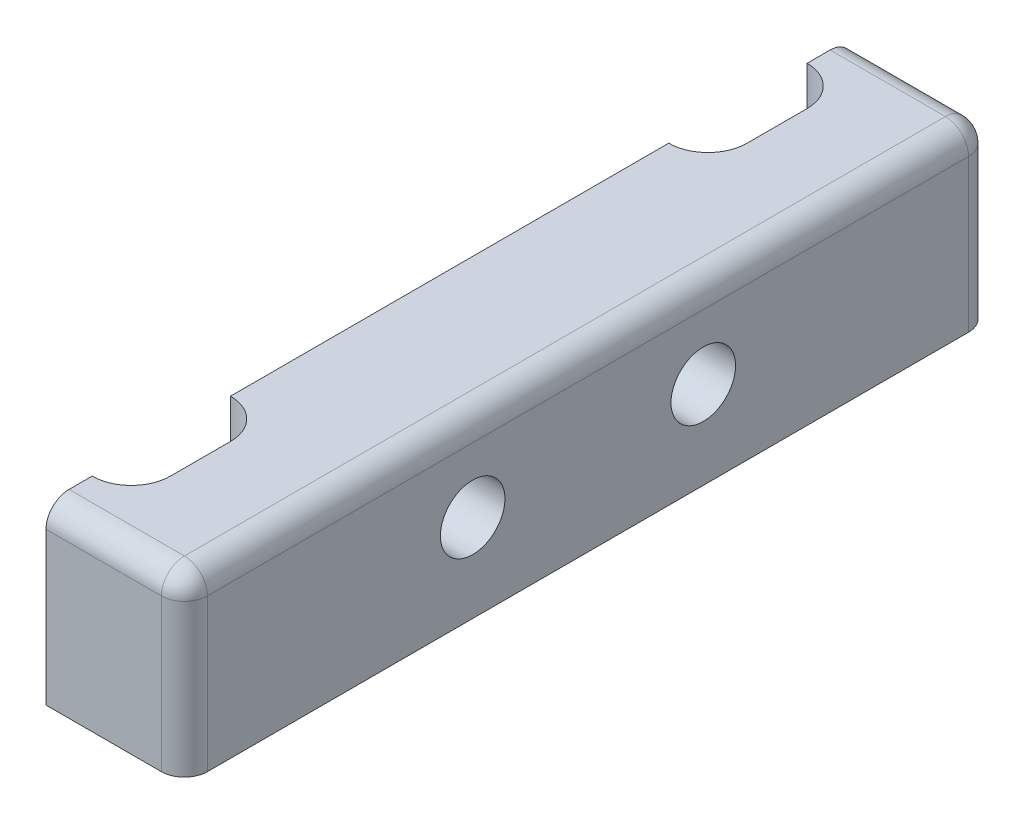
ISO-10303-21;
HEADER;
FILE_DESCRIPTION(('STEP AP214'),'2;1');
FILE_NAME('part.step','',(''),(''),'','','');
FILE_SCHEMA(('AUTOMOTIVE_DESIGN { 1 0 10303 214 1 1 1 1 }'));
ENDSEC;
DATA;
#1=APPLICATION_CONTEXT('core data for automotive mechanical design processes');
#2=APPLICATION_PROTOCOL_DEFINITION('international standard','automotive_design',2000,#1);
#3=PRODUCT_CONTEXT('',#1,'mechanical');
#4=PRODUCT('Part','Part','',(#3));
#5=PRODUCT_RELATED_PRODUCT_CATEGORY('part','',(#4));
#6=PRODUCT_DEFINITION_FORMATION('','',#4);
#7=PRODUCT_DEFINITION_CONTEXT('part definition',#1,'design');
#8=PRODUCT_DEFINITION('design','',#6,#7);
#9=PRODUCT_DEFINITION_SHAPE('','',#8);
#10=(LENGTH_UNIT() NAMED_UNIT(*) SI_UNIT(.MILLI.,.METRE.));
#11=(NAMED_UNIT(*) PLANE_ANGLE_UNIT() SI_UNIT($,.RADIAN.));
#12=(NAMED_UNIT(*) SI_UNIT($,.STERADIAN.) SOLID_ANGLE_UNIT());
#13=UNCERTAINTY_MEASURE_WITH_UNIT(LENGTH_MEASURE(1.E-05),#10,'distance_accuracy_value','');
#14=(GEOMETRIC_REPRESENTATION_CONTEXT(3) GLOBAL_UNCERTAINTY_ASSIGNED_CONTEXT((#13)) GLOBAL_UNIT_ASSIGNED_CONTEXT((#10,
#11,#12)) REPRESENTATION_CONTEXT('',''));
#15=CARTESIAN_POINT('',(0.,0.,0.));
#16=DIRECTION('',(0.,0.,1.));
#17=DIRECTION('',(1.,0.,0.));
#18=AXIS2_PLACEMENT_3D('',#15,#16,#17);
#19=CARTESIAN_POINT('',(-6.,7.6,-17.5));
#20=DIRECTION('',(0.,0.,1.));
#21=DIRECTION('',(1.,0.,0.));
#22=AXIS2_PLACEMENT_3D('',#19,#20,#21);
#23=PLANE('',#22);
#24=DIRECTION('',(-1.,0.,0.));
#25=VECTOR('',#24,1.);
#26=CARTESIAN_POINT('',(-6.,6.6,-17.5));
#27=LINE('',#26,#25);
#28=CARTESIAN_POINT('',(-6.,6.6,-17.5));
#29=VERTEX_POINT('',#28);
#30=CARTESIAN_POINT('',(-1.00000000000001,6.6,-17.5));
#31=VERTEX_POINT('',#30);
#32=EDGE_CURVE('E276',#29,#31,#27,.F.);
#33=ORIENTED_EDGE('',*,*,#32,.T.);
#34=DIRECTION('',(0.,-1.,0.));
#35=VECTOR('',#34,1.);
#36=CARTESIAN_POINT('',(-1.00000000000001,7.6,-17.5));
#37=LINE('',#36,#35);
#38=CARTESIAN_POINT('',(-1.00000000000001,0.,-17.5));
#39=VERTEX_POINT('',#38);
#40=EDGE_CURVE('E279',#31,#39,#37,.T.);
#41=ORIENTED_EDGE('',*,*,#40,.T.);
#42=DIRECTION('',(-1.,0.,0.));
#43=VECTOR('',#42,1.);
#44=CARTESIAN_POINT('',(-6.,0.,-17.5));
#45=LINE('',#44,#43);
#46=CARTESIAN_POINT('',(-6.,0.,-17.5));
#47=VERTEX_POINT('',#46);
#48=EDGE_CURVE('E208',#39,#47,#45,.T.);
#49=ORIENTED_EDGE('',*,*,#48,.T.);
#50=DIRECTION('',(0.,-1.,0.));
#51=VECTOR('',#50,1.);
#52=CARTESIAN_POINT('',(-6.,7.6,-17.5));
#53=LINE('',#52,#51);
#54=EDGE_CURVE('E175',#29,#47,#53,.T.);
#55=ORIENTED_EDGE('',*,*,#54,.F.);
#56=EDGE_LOOP('',(#33,#41,#49,#55));
#57=FACE_BOUND('',#56,.T.);
#58=ADVANCED_FACE('F42',(#57),#23,.F.);
#59=CARTESIAN_POINT('',(-6.,7.6,-17.5));
#60=DIRECTION('',(1.,0.,0.));
#61=DIRECTION('',(0.,0.,-1.));
#62=AXIS2_PLACEMENT_3D('',#59,#60,#61);
#63=PLANE('',#62);
#64=DIRECTION('',(0.,0.,1.));
#65=VECTOR('',#64,1.);
#66=CARTESIAN_POINT('',(-6.,7.6,-17.5));
#67=LINE('',#66,#65);
#68=CARTESIAN_POINT('',(-6.,7.6,-16.5));
#69=VERTEX_POINT('',#68);
#70=CARTESIAN_POINT('',(-6.,7.6,-15.5));
#71=VERTEX_POINT('',#70);
#72=EDGE_CURVE('E154',#69,#71,#67,.T.);
#73=ORIENTED_EDGE('',*,*,#72,.F.);
#74=CARTESIAN_POINT('',(-6.,6.6,-16.5));
#75=DIRECTION('',(1.,0.,0.));
#76=DIRECTION('',(0.,0.,-1.));
#77=AXIS2_PLACEMENT_3D('',#74,#75,#76);
#78=CIRCLE('',#77,1.);
#79=EDGE_CURVE('E306',#69,#29,#78,.F.);
#80=ORIENTED_EDGE('',*,*,#79,.T.);
#81=ORIENTED_EDGE('',*,*,#54,.T.);
#82=DIRECTION('',(0.,0.,1.));
#83=VECTOR('',#82,1.);
#84=CARTESIAN_POINT('',(-6.,0.,-17.5));
#85=LINE('',#84,#83);
#86=CARTESIAN_POINT('',(-6.,0.,-15.5));
#87=VERTEX_POINT('',#86);
#88=EDGE_CURVE('E171',#47,#87,#85,.T.);
#89=ORIENTED_EDGE('',*,*,#88,.T.);
#90=DIRECTION('',(0.,-1.,0.));
#91=VECTOR('',#90,1.);
#92=CARTESIAN_POINT('',(-6.,7.6,-15.5));
#93=LINE('',#92,#91);
#94=EDGE_CURVE('E168',#71,#87,#93,.T.);
#95=ORIENTED_EDGE('',*,*,#94,.F.);
#96=EDGE_LOOP('',(#73,#80,#81,#89,#95));
#97=FACE_BOUND('',#96,.T.);
#98=ADVANCED_FACE('F169',(#97),#63,.F.);
#99=CARTESIAN_POINT('',(-6.,7.6,-13.8));
#100=DIRECTION('',(0.,-1.,0.));
#101=DIRECTION('',(0.,0.,-1.));
#102=AXIS2_PLACEMENT_3D('',#99,#100,#101);
#103=CYLINDRICAL_SURFACE('',#102,1.7);
#104=CARTESIAN_POINT('',(-6.,0.,-13.8));
#105=DIRECTION('',(0.,-1.,0.));
#106=DIRECTION('',(0.,0.,1.));
#107=AXIS2_PLACEMENT_3D('',#104,#105,#106);
#108=CIRCLE('',#107,1.7);
#109=CARTESIAN_POINT('',(-4.3,0.,-13.8));
#110=VERTEX_POINT('',#109);
#111=EDGE_CURVE('E215',#87,#110,#108,.T.);
#112=ORIENTED_EDGE('',*,*,#111,.T.);
#113=DIRECTION('',(0.,-1.,0.));
#114=VECTOR('',#113,1.);
#115=CARTESIAN_POINT('',(-4.3,7.6,-13.8));
#116=LINE('',#115,#114);
#117=CARTESIAN_POINT('',(-4.3,7.6,-13.8));
#118=VERTEX_POINT('',#117);
#119=EDGE_CURVE('E176',#118,#110,#116,.T.);
#120=ORIENTED_EDGE('',*,*,#119,.F.);
#121=CARTESIAN_POINT('',(-6.,7.6,-13.8));
#122=DIRECTION('',(0.,-1.,0.));
#123=DIRECTION('',(0.,0.,1.));
#124=AXIS2_PLACEMENT_3D('',#121,#122,#123);
#125=CIRCLE('',#124,1.7);
#126=EDGE_CURVE('E158',#71,#118,#125,.T.);
#127=ORIENTED_EDGE('',*,*,#126,.F.);
#128=ORIENTED_EDGE('',*,*,#94,.T.);
#129=EDGE_LOOP('',(#112,#120,#127,#128));
#130=FACE_BOUND('',#129,.T.);
#131=ADVANCED_FACE('F178',(#130),#103,.F.);
#132=CARTESIAN_POINT('',(-4.29999999999999,7.6,-11.2));
#133=DIRECTION('',(1.,0.,0.));
#134=DIRECTION('',(0.,0.,-1.));
#135=AXIS2_PLACEMENT_3D('',#132,#133,#134);
#136=PLANE('',#135);
#137=DIRECTION('',(0.,0.,1.));
#138=VECTOR('',#137,1.);
#139=CARTESIAN_POINT('',(-4.29999999999999,0.,-11.2));
#140=LINE('',#139,#138);
#141=CARTESIAN_POINT('',(-4.29999999999999,0.,-11.2));
#142=VERTEX_POINT('',#141);
#143=EDGE_CURVE('E218',#110,#142,#140,.T.);
#144=ORIENTED_EDGE('',*,*,#143,.T.);
#145=DIRECTION('',(0.,-1.,0.));
#146=VECTOR('',#145,1.);
#147=CARTESIAN_POINT('',(-4.29999999999999,7.6,-11.2));
#148=LINE('',#147,#146);
#149=CARTESIAN_POINT('',(-4.29999999999999,7.6,-11.2));
#150=VERTEX_POINT('',#149);
#151=EDGE_CURVE('E268',#150,#142,#148,.T.);
#152=ORIENTED_EDGE('',*,*,#151,.F.);
#153=DIRECTION('',(0.,0.,1.));
#154=VECTOR('',#153,1.);
#155=CARTESIAN_POINT('',(-4.29999999999999,7.6,-11.2));
#156=LINE('',#155,#154);
#157=EDGE_CURVE('E182',#118,#150,#156,.T.);
#158=ORIENTED_EDGE('',*,*,#157,.F.);
#159=ORIENTED_EDGE('',*,*,#119,.T.);
#160=EDGE_LOOP('',(#144,#152,#158,#159));
#161=FACE_BOUND('',#160,.T.);
#162=ADVANCED_FACE('F402',(#161),#136,.F.);
#163=CARTESIAN_POINT('',(-5.99999999999999,7.6,-11.2));
#164=DIRECTION('',(0.,-1.,0.));
#165=DIRECTION('',(0.,0.,-1.));
#166=AXIS2_PLACEMENT_3D('',#163,#164,#165);
#167=CYLINDRICAL_SURFACE('',#166,1.7);
#168=CARTESIAN_POINT('',(-5.99999999999999,0.,-11.2));
#169=DIRECTION('',(0.,-1.,0.));
#170=DIRECTION('',(0.,0.,-1.));
#171=AXIS2_PLACEMENT_3D('',#168,#169,#170);
#172=CIRCLE('',#171,1.7);
#173=CARTESIAN_POINT('',(-6.,0.,-9.49999999999999));
#174=VERTEX_POINT('',#173);
#175=EDGE_CURVE('E221',#142,#174,#172,.T.);
#176=ORIENTED_EDGE('',*,*,#175,.T.);
#177=DIRECTION('',(0.,-1.,0.));
#178=VECTOR('',#177,1.);
#179=CARTESIAN_POINT('',(-6.,7.6,-9.49999999999999));
#180=LINE('',#179,#178);
#181=CARTESIAN_POINT('',(-6.,7.6,-9.49999999999999));
#182=VERTEX_POINT('',#181);
#183=EDGE_CURVE('E264',#182,#174,#180,.T.);
#184=ORIENTED_EDGE('',*,*,#183,.F.);
#185=CARTESIAN_POINT('',(-5.99999999999999,7.6,-11.2));
#186=DIRECTION('',(0.,-1.,0.));
#187=DIRECTION('',(0.,0.,-1.));
#188=AXIS2_PLACEMENT_3D('',#185,#186,#187);
#189=CIRCLE('',#188,1.7);
#190=EDGE_CURVE('E185',#150,#182,#189,.T.);
#191=ORIENTED_EDGE('',*,*,#190,.F.);
#192=ORIENTED_EDGE('',*,*,#151,.T.);
#193=EDGE_LOOP('',(#176,#184,#191,#192));
#194=FACE_BOUND('',#193,.T.);
#195=ADVANCED_FACE('F368',(#194),#167,.F.);
#196=CARTESIAN_POINT('',(-6.,7.6,-9.49999999999999));
#197=DIRECTION('',(1.,0.,0.));
#198=DIRECTION('',(0.,0.,-1.));
#199=AXIS2_PLACEMENT_3D('',#196,#197,#198);
#200=PLANE('',#199);
#201=CARTESIAN_POINT('',(-6.,3.8,-4.99999999999999));
#202=DIRECTION('',(-1.,0.,0.));
#203=DIRECTION('',(0.,0.,1.));
#204=AXIS2_PLACEMENT_3D('',#201,#202,#203);
#205=CIRCLE('',#204,1.4);
#206=CARTESIAN_POINT('',(-6.,3.8,-3.6));
#207=VERTEX_POINT('',#206);
#208=EDGE_CURVE('E345',#207,#207,#205,.T.);
#209=ORIENTED_EDGE('',*,*,#208,.F.);
#210=EDGE_LOOP('',(#209));
#211=FACE_BOUND('',#210,.T.);
#212=CARTESIAN_POINT('',(-6.,3.79999999999999,5.));
#213=DIRECTION('',(-1.,0.,0.));
#214=DIRECTION('',(0.,0.,-1.));
#215=AXIS2_PLACEMENT_3D('',#212,#213,#214);
#216=CIRCLE('',#215,1.4);
#217=CARTESIAN_POINT('',(-6.,3.79999999999999,3.6));
#218=VERTEX_POINT('',#217);
#219=EDGE_CURVE('E340',#218,#218,#216,.T.);
#220=ORIENTED_EDGE('',*,*,#219,.F.);
#221=EDGE_LOOP('',(#220));
#222=FACE_BOUND('',#221,.T.);
#223=DIRECTION('',(0.,0.,1.));
#224=VECTOR('',#223,1.);
#225=CARTESIAN_POINT('',(-6.,0.,-9.49999999999999));
#226=LINE('',#225,#224);
#227=CARTESIAN_POINT('',(-6.,0.,9.50000000000001));
#228=VERTEX_POINT('',#227);
#229=EDGE_CURVE('E224',#174,#228,#226,.T.);
#230=ORIENTED_EDGE('',*,*,#229,.T.);
#231=DIRECTION('',(0.,-1.,0.));
#232=VECTOR('',#231,1.);
#233=CARTESIAN_POINT('',(-6.,7.6,9.50000000000001));
#234=LINE('',#233,#232);
#235=CARTESIAN_POINT('',(-6.,7.6,9.50000000000001));
#236=VERTEX_POINT('',#235);
#237=EDGE_CURVE('E260',#236,#228,#234,.T.);
#238=ORIENTED_EDGE('',*,*,#237,.F.);
#239=DIRECTION('',(0.,0.,1.));
#240=VECTOR('',#239,1.);
#241=CARTESIAN_POINT('',(-6.,7.6,-9.49999999999999));
#242=LINE('',#241,#240);
#243=EDGE_CURVE('E191',#182,#236,#242,.T.);
#244=ORIENTED_EDGE('',*,*,#243,.F.);
#245=ORIENTED_EDGE('',*,*,#183,.T.);
#246=EDGE_LOOP('',(#230,#238,#244,#245));
#247=FACE_BOUND('',#246,.T.);
#248=ADVANCED_FACE('F364',(#211,#222,#247),#200,.F.);
#249=CARTESIAN_POINT('',(-6.,7.6,11.2));
#250=DIRECTION('',(0.,-1.,0.));
#251=DIRECTION('',(0.,0.,-1.));
#252=AXIS2_PLACEMENT_3D('',#249,#250,#251);
#253=CYLINDRICAL_SURFACE('',#252,1.7);
#254=CARTESIAN_POINT('',(-6.,0.,11.2));
#255=DIRECTION('',(0.,-1.,0.));
#256=DIRECTION('',(0.,0.,1.));
#257=AXIS2_PLACEMENT_3D('',#254,#255,#256);
#258=CIRCLE('',#257,1.7);
#259=CARTESIAN_POINT('',(-4.3,0.,11.2));
#260=VERTEX_POINT('',#259);
#261=EDGE_CURVE('E227',#228,#260,#258,.T.);
#262=ORIENTED_EDGE('',*,*,#261,.T.);
#263=DIRECTION('',(0.,-1.,0.));
#264=VECTOR('',#263,1.);
#265=CARTESIAN_POINT('',(-4.3,7.6,11.2));
#266=LINE('',#265,#264);
#267=CARTESIAN_POINT('',(-4.3,7.6,11.2));
#268=VERTEX_POINT('',#267);
#269=EDGE_CURVE('E256',#268,#260,#266,.T.);
#270=ORIENTED_EDGE('',*,*,#269,.F.);
#271=CARTESIAN_POINT('',(-6.,7.6,11.2));
#272=DIRECTION('',(0.,-1.,0.));
#273=DIRECTION('',(0.,0.,1.));
#274=AXIS2_PLACEMENT_3D('',#271,#272,#273);
#275=CIRCLE('',#274,1.7);
#276=EDGE_CURVE('E194',#236,#268,#275,.T.);
#277=ORIENTED_EDGE('',*,*,#276,.F.);
#278=ORIENTED_EDGE('',*,*,#237,.T.);
#279=EDGE_LOOP('',(#262,#270,#277,#278));
#280=FACE_BOUND('',#279,.T.);
#281=ADVANCED_FACE('F367',(#280),#253,.F.);
#282=CARTESIAN_POINT('',(-4.29999999999999,7.6,13.8));
#283=DIRECTION('',(1.,0.,0.));
#284=DIRECTION('',(0.,0.,-1.));
#285=AXIS2_PLACEMENT_3D('',#282,#283,#284);
#286=PLANE('',#285);
#287=DIRECTION('',(0.,0.,1.));
#288=VECTOR('',#287,1.);
#289=CARTESIAN_POINT('',(-4.29999999999999,0.,13.8));
#290=LINE('',#289,#288);
#291=CARTESIAN_POINT('',(-4.29999999999999,0.,13.8));
#292=VERTEX_POINT('',#291);
#293=EDGE_CURVE('E230',#260,#292,#290,.T.);
#294=ORIENTED_EDGE('',*,*,#293,.T.);
#295=DIRECTION('',(0.,-1.,0.));
#296=VECTOR('',#295,1.);
#297=CARTESIAN_POINT('',(-4.29999999999999,7.6,13.8));
#298=LINE('',#297,#296);
#299=CARTESIAN_POINT('',(-4.29999999999999,7.6,13.8));
#300=VERTEX_POINT('',#299);
#301=EDGE_CURVE('E252',#300,#292,#298,.T.);
#302=ORIENTED_EDGE('',*,*,#301,.F.);
#303=DIRECTION('',(0.,0.,1.));
#304=VECTOR('',#303,1.);
#305=CARTESIAN_POINT('',(-4.29999999999999,7.6,13.8));
#306=LINE('',#305,#304);
#307=EDGE_CURVE('E197',#268,#300,#306,.T.);
#308=ORIENTED_EDGE('',*,*,#307,.F.);
#309=ORIENTED_EDGE('',*,*,#269,.T.);
#310=EDGE_LOOP('',(#294,#302,#308,#309));
#311=FACE_BOUND('',#310,.T.);
#312=ADVANCED_FACE('F389',(#311),#286,.F.);
#313=CARTESIAN_POINT('',(-6.,7.6,13.8));
#314=DIRECTION('',(0.,-1.,0.));
#315=DIRECTION('',(0.,0.,-1.));
#316=AXIS2_PLACEMENT_3D('',#313,#314,#315);
#317=CYLINDRICAL_SURFACE('',#316,1.7);
#318=CARTESIAN_POINT('',(-6.,0.,13.8));
#319=DIRECTION('',(0.,-1.,0.));
#320=DIRECTION('',(0.,0.,-1.));
#321=AXIS2_PLACEMENT_3D('',#318,#319,#320);
#322=CIRCLE('',#321,1.7);
#323=CARTESIAN_POINT('',(-6.,0.,15.5));
#324=VERTEX_POINT('',#323);
#325=EDGE_CURVE('E233',#292,#324,#322,.T.);
#326=ORIENTED_EDGE('',*,*,#325,.T.);
#327=DIRECTION('',(0.,-1.,0.));
#328=VECTOR('',#327,1.);
#329=CARTESIAN_POINT('',(-6.,7.6,15.5));
#330=LINE('',#329,#328);
#331=CARTESIAN_POINT('',(-6.,7.6,15.5));
#332=VERTEX_POINT('',#331);
#333=EDGE_CURVE('E248',#332,#324,#330,.T.);
#334=ORIENTED_EDGE('',*,*,#333,.F.);
#335=CARTESIAN_POINT('',(-6.,7.6,13.8));
#336=DIRECTION('',(0.,-1.,0.));
#337=DIRECTION('',(0.,0.,-1.));
#338=AXIS2_PLACEMENT_3D('',#335,#336,#337);
#339=CIRCLE('',#338,1.7);
#340=EDGE_CURVE('E200',#300,#332,#339,.T.);
#341=ORIENTED_EDGE('',*,*,#340,.F.);
#342=ORIENTED_EDGE('',*,*,#301,.T.);
#343=EDGE_LOOP('',(#326,#334,#341,#342));
#344=FACE_BOUND('',#343,.T.);
#345=ADVANCED_FACE('F393',(#344),#317,.F.);
#346=CARTESIAN_POINT('',(-6.,7.6,17.5));
#347=DIRECTION('',(1.,0.,0.));
#348=DIRECTION('',(0.,0.,-1.));
#349=AXIS2_PLACEMENT_3D('',#346,#347,#348);
#350=PLANE('',#349);
#351=DIRECTION('',(0.,-1.,0.));
#352=VECTOR('',#351,1.);
#353=CARTESIAN_POINT('',(-6.,7.6,17.5));
#354=LINE('',#353,#352);
#355=CARTESIAN_POINT('',(-6.,6.6,17.5));
#356=VERTEX_POINT('',#355);
#357=CARTESIAN_POINT('',(-6.,0.,17.5));
#358=VERTEX_POINT('',#357);
#359=EDGE_CURVE('E207',#356,#358,#354,.T.);
#360=ORIENTED_EDGE('',*,*,#359,.F.);
#361=CARTESIAN_POINT('',(-6.,6.6,16.5));
#362=DIRECTION('',(1.,0.,0.));
#363=DIRECTION('',(0.,0.,-1.));
#364=AXIS2_PLACEMENT_3D('',#361,#362,#363);
#365=CIRCLE('',#364,1.);
#366=CARTESIAN_POINT('',(-6.,7.6,16.5));
#367=VERTEX_POINT('',#366);
#368=EDGE_CURVE('E11',#356,#367,#365,.F.);
#369=ORIENTED_EDGE('',*,*,#368,.T.);
#370=DIRECTION('',(0.,0.,1.));
#371=VECTOR('',#370,1.);
#372=CARTESIAN_POINT('',(-6.,7.6,17.5));
#373=LINE('',#372,#371);
#374=EDGE_CURVE('E203',#332,#367,#373,.T.);
#375=ORIENTED_EDGE('',*,*,#374,.F.);
#376=ORIENTED_EDGE('',*,*,#333,.T.);
#377=DIRECTION('',(0.,0.,1.));
#378=VECTOR('',#377,1.);
#379=CARTESIAN_POINT('',(-6.,0.,17.5));
#380=LINE('',#379,#378);
#381=EDGE_CURVE('E236',#324,#358,#380,.T.);
#382=ORIENTED_EDGE('',*,*,#381,.T.);
#383=EDGE_LOOP('',(#360,#369,#375,#376,#382));
#384=FACE_BOUND('',#383,.T.);
#385=ADVANCED_FACE('F447',(#384),#350,.F.);
#386=CARTESIAN_POINT('',(-6.,7.6,17.5));
#387=DIRECTION('',(0.,0.,-1.));
#388=DIRECTION('',(-1.,0.,0.));
#389=AXIS2_PLACEMENT_3D('',#386,#387,#388);
#390=PLANE('',#389);
#391=DIRECTION('',(1.,0.,0.));
#392=VECTOR('',#391,1.);
#393=CARTESIAN_POINT('',(-6.,0.,17.5));
#394=LINE('',#393,#392);
#395=CARTESIAN_POINT('',(-0.999999999999995,0.,17.5));
#396=VERTEX_POINT('',#395);
#397=EDGE_CURVE('E240',#358,#396,#394,.T.);
#398=ORIENTED_EDGE('',*,*,#397,.T.);
#399=DIRECTION('',(0.,-1.,0.));
#400=VECTOR('',#399,1.);
#401=CARTESIAN_POINT('',(-0.999999999999995,7.6,17.5));
#402=LINE('',#401,#400);
#403=CARTESIAN_POINT('',(-0.999999999999995,6.6,17.5));
#404=VERTEX_POINT('',#403);
#405=EDGE_CURVE('E52',#396,#404,#402,.F.);
#406=ORIENTED_EDGE('',*,*,#405,.T.);
#407=DIRECTION('',(1.,0.,0.));
#408=VECTOR('',#407,1.);
#409=CARTESIAN_POINT('',(-6.,6.6,17.5));
#410=LINE('',#409,#408);
#411=EDGE_CURVE('E63',#404,#356,#410,.F.);
#412=ORIENTED_EDGE('',*,*,#411,.T.);
#413=ORIENTED_EDGE('',*,*,#359,.T.);
#414=EDGE_LOOP('',(#398,#406,#412,#413));
#415=FACE_BOUND('',#414,.T.);
#416=ADVANCED_FACE('F449',(#415),#390,.F.);
#417=CARTESIAN_POINT('',(0.,7.6,-17.5));
#418=DIRECTION('',(-1.,0.,0.));
#419=DIRECTION('',(0.,0.,1.));
#420=AXIS2_PLACEMENT_3D('',#417,#418,#419);
#421=PLANE('',#420);
#422=CARTESIAN_POINT('',(0.,3.8,-5.));
#423=DIRECTION('',(-1.,0.,0.));
#424=DIRECTION('',(0.,0.,1.));
#425=AXIS2_PLACEMENT_3D('',#422,#423,#424);
#426=CIRCLE('',#425,1.4);
#427=CARTESIAN_POINT('',(0.,3.8,-3.6));
#428=VERTEX_POINT('',#427);
#429=EDGE_CURVE('E212',#428,#428,#426,.T.);
#430=ORIENTED_EDGE('',*,*,#429,.T.);
#431=EDGE_LOOP('',(#430));
#432=FACE_BOUND('',#431,.T.);
#433=CARTESIAN_POINT('',(0.,3.79999999999999,5.));
#434=DIRECTION('',(-1.,0.,0.));
#435=DIRECTION('',(0.,0.,-1.));
#436=AXIS2_PLACEMENT_3D('',#433,#434,#435);
#437=CIRCLE('',#436,1.4);
#438=CARTESIAN_POINT('',(0.,3.79999999999999,3.6));
#439=VERTEX_POINT('',#438);
#440=EDGE_CURVE('E336',#439,#439,#437,.T.);
#441=ORIENTED_EDGE('',*,*,#440,.T.);
#442=EDGE_LOOP('',(#441));
#443=FACE_BOUND('',#442,.T.);
#444=DIRECTION('',(0.,0.,-1.));
#445=VECTOR('',#444,1.);
#446=CARTESIAN_POINT('',(0.,0.,-17.5));
#447=LINE('',#446,#445);
#448=CARTESIAN_POINT('',(0.,0.,16.5));
#449=VERTEX_POINT('',#448);
#450=CARTESIAN_POINT('',(0.,0.,-16.5));
#451=VERTEX_POINT('',#450);
#452=EDGE_CURVE('E165',#449,#451,#447,.T.);
#453=ORIENTED_EDGE('',*,*,#452,.T.);
#454=DIRECTION('',(0.,-1.,0.));
#455=VECTOR('',#454,1.);
#456=CARTESIAN_POINT('',(0.,7.6,-16.5));
#457=LINE('',#456,#455);
#458=CARTESIAN_POINT('',(0.,6.6,-16.5));
#459=VERTEX_POINT('',#458);
#460=EDGE_CURVE('E295',#451,#459,#457,.F.);
#461=ORIENTED_EDGE('',*,*,#460,.T.);
#462=DIRECTION('',(0.,0.,-1.));
#463=VECTOR('',#462,1.);
#464=CARTESIAN_POINT('',(0.,6.6,-17.5));
#465=LINE('',#464,#463);
#466=CARTESIAN_POINT('',(0.,6.6,16.5));
#467=VERTEX_POINT('',#466);
#468=EDGE_CURVE('E292',#459,#467,#465,.F.);
#469=ORIENTED_EDGE('',*,*,#468,.T.);
#470=DIRECTION('',(0.,-1.,0.));
#471=VECTOR('',#470,1.);
#472=CARTESIAN_POINT('',(0.,7.6,16.5));
#473=LINE('',#472,#471);
#474=EDGE_CURVE('E289',#467,#449,#473,.T.);
#475=ORIENTED_EDGE('',*,*,#474,.T.);
#476=EDGE_LOOP('',(#453,#461,#469,#475));
#477=FACE_BOUND('',#476,.T.);
#478=ADVANCED_FACE('F355',(#432,#443,#477),#421,.F.);
#479=CARTESIAN_POINT('',(-6.,7.6,13.8));
#480=DIRECTION('',(0.,-1.,0.));
#481=DIRECTION('',(0.,0.,-1.));
#482=AXIS2_PLACEMENT_3D('',#479,#480,#481);
#483=PLANE('',#482);
#484=DIRECTION('',(0.,0.,-1.));
#485=VECTOR('',#484,1.);
#486=CARTESIAN_POINT('',(-0.999999999999997,7.6,13.8));
#487=LINE('',#486,#485);
#488=CARTESIAN_POINT('',(-0.999999999999996,7.6,16.5));
#489=VERTEX_POINT('',#488);
#490=CARTESIAN_POINT('',(-1.00000000000001,7.6,-16.5));
#491=VERTEX_POINT('',#490);
#492=EDGE_CURVE('E301',#489,#491,#487,.T.);
#493=ORIENTED_EDGE('',*,*,#492,.T.);
#494=DIRECTION('',(-1.,0.,0.));
#495=VECTOR('',#494,1.);
#496=CARTESIAN_POINT('',(-6.00000000000001,7.6,-16.5));
#497=LINE('',#496,#495);
#498=EDGE_CURVE('E161',#491,#69,#497,.T.);
#499=ORIENTED_EDGE('',*,*,#498,.T.);
#500=ORIENTED_EDGE('',*,*,#72,.T.);
#501=ORIENTED_EDGE('',*,*,#126,.T.);
#502=ORIENTED_EDGE('',*,*,#157,.T.);
#503=ORIENTED_EDGE('',*,*,#190,.T.);
#504=ORIENTED_EDGE('',*,*,#243,.T.);
#505=ORIENTED_EDGE('',*,*,#276,.T.);
#506=ORIENTED_EDGE('',*,*,#307,.T.);
#507=ORIENTED_EDGE('',*,*,#340,.T.);
#508=ORIENTED_EDGE('',*,*,#374,.T.);
#509=DIRECTION('',(1.,0.,0.));
#510=VECTOR('',#509,1.);
#511=CARTESIAN_POINT('',(-5.99999999999999,7.6,16.5));
#512=LINE('',#511,#510);
#513=EDGE_CURVE('E298',#367,#489,#512,.T.);
#514=ORIENTED_EDGE('',*,*,#513,.T.);
#515=EDGE_LOOP('',(#493,#499,#500,#501,#502,#503,#504,#505,#506,#507,#508,#514));
#516=FACE_BOUND('',#515,.T.);
#517=ADVANCED_FACE('F156',(#516),#483,.F.);
#518=CARTESIAN_POINT('',(-6.,0.,13.8));
#519=DIRECTION('',(0.,-1.,0.));
#520=DIRECTION('',(0.,0.,-1.));
#521=AXIS2_PLACEMENT_3D('',#518,#519,#520);
#522=PLANE('',#521);
#523=ORIENTED_EDGE('',*,*,#48,.F.);
#524=CARTESIAN_POINT('',(-1.00000000000001,0.,-16.5));
#525=DIRECTION('',(0.,-1.,0.));
#526=DIRECTION('',(0.,0.,-1.));
#527=AXIS2_PLACEMENT_3D('',#524,#525,#526);
#528=CIRCLE('',#527,1.);
#529=EDGE_CURVE('E286',#39,#451,#528,.T.);
#530=ORIENTED_EDGE('',*,*,#529,.T.);
#531=ORIENTED_EDGE('',*,*,#452,.F.);
#532=CARTESIAN_POINT('',(-0.999999999999996,0.,16.5));
#533=DIRECTION('',(0.,-1.,0.));
#534=DIRECTION('',(0.,0.,-1.));
#535=AXIS2_PLACEMENT_3D('',#532,#533,#534);
#536=CIRCLE('',#535,1.);
#537=EDGE_CURVE('E283',#449,#396,#536,.T.);
#538=ORIENTED_EDGE('',*,*,#537,.T.);
#539=ORIENTED_EDGE('',*,*,#397,.F.);
#540=ORIENTED_EDGE('',*,*,#381,.F.);
#541=ORIENTED_EDGE('',*,*,#325,.F.);
#542=ORIENTED_EDGE('',*,*,#293,.F.);
#543=ORIENTED_EDGE('',*,*,#261,.F.);
#544=ORIENTED_EDGE('',*,*,#229,.F.);
#545=ORIENTED_EDGE('',*,*,#175,.F.);
#546=ORIENTED_EDGE('',*,*,#143,.F.);
#547=ORIENTED_EDGE('',*,*,#111,.F.);
#548=ORIENTED_EDGE('',*,*,#88,.F.);
#549=EDGE_LOOP('',(#523,#530,#531,#538,#539,#540,#541,#542,#543,#544,#545,#546,#547,#548));
#550=FACE_BOUND('',#549,.T.);
#551=ADVANCED_FACE('F384',(#550),#522,.T.);
#552=CARTESIAN_POINT('',(0.,3.79999999999999,5.));
#553=DIRECTION('',(-1.,0.,0.));
#554=DIRECTION('',(0.,0.,1.));
#555=AXIS2_PLACEMENT_3D('',#552,#553,#554);
#556=CYLINDRICAL_SURFACE('',#555,1.4);
#557=ORIENTED_EDGE('',*,*,#440,.F.);
#558=EDGE_LOOP('',(#557));
#559=FACE_BOUND('',#558,.T.);
#560=ORIENTED_EDGE('',*,*,#219,.T.);
#561=EDGE_LOOP('',(#560));
#562=FACE_BOUND('',#561,.T.);
#563=ADVANCED_FACE('F360',(#559,#562),#556,.F.);
#564=CARTESIAN_POINT('',(0.,3.8,-5.));
#565=DIRECTION('',(-1.,0.,0.));
#566=DIRECTION('',(0.,0.,1.));
#567=AXIS2_PLACEMENT_3D('',#564,#565,#566);
#568=CYLINDRICAL_SURFACE('',#567,1.4);
#569=ORIENTED_EDGE('',*,*,#429,.F.);
#570=EDGE_LOOP('',(#569));
#571=FACE_BOUND('',#570,.T.);
#572=ORIENTED_EDGE('',*,*,#208,.T.);
#573=EDGE_LOOP('',(#572));
#574=FACE_BOUND('',#573,.T.);
#575=ADVANCED_FACE('F357',(#571,#574),#568,.F.);
#576=CARTESIAN_POINT('',(-0.999999999999996,7.6,16.5));
#577=DIRECTION('',(0.,-1.,0.));
#578=DIRECTION('',(0.,0.,-1.));
#579=AXIS2_PLACEMENT_3D('',#576,#577,#578);
#580=CYLINDRICAL_SURFACE('',#579,1.);
#581=ORIENTED_EDGE('',*,*,#537,.F.);
#582=ORIENTED_EDGE('',*,*,#474,.F.);
#583=CARTESIAN_POINT('',(-0.999999999999996,6.6,16.5));
#584=DIRECTION('',(0.,1.,0.));
#585=DIRECTION('',(0.,0.,1.));
#586=AXIS2_PLACEMENT_3D('',#583,#584,#585);
#587=CIRCLE('',#586,1.);
#588=EDGE_CURVE('E46',#404,#467,#587,.T.);
#589=ORIENTED_EDGE('',*,*,#588,.F.);
#590=ORIENTED_EDGE('',*,*,#405,.F.);
#591=EDGE_LOOP('',(#581,#582,#589,#590));
#592=FACE_BOUND('',#591,.T.);
#593=ADVANCED_FACE('F44',(#592),#580,.T.);
#594=CARTESIAN_POINT('',(-5.99999999999999,6.6,16.5));
#595=DIRECTION('',(1.,0.,0.));
#596=DIRECTION('',(0.,0.,-1.));
#597=AXIS2_PLACEMENT_3D('',#594,#595,#596);
#598=CYLINDRICAL_SURFACE('',#597,1.);
#599=ORIENTED_EDGE('',*,*,#368,.F.);
#600=ORIENTED_EDGE('',*,*,#411,.F.);
#601=CARTESIAN_POINT('',(-0.999999999999996,6.6,16.5));
#602=DIRECTION('',(1.,0.,0.));
#603=DIRECTION('',(0.,0.,-1.));
#604=AXIS2_PLACEMENT_3D('',#601,#602,#603);
#605=CIRCLE('',#604,1.);
#606=EDGE_CURVE('E328',#489,#404,#605,.T.);
#607=ORIENTED_EDGE('',*,*,#606,.F.);
#608=ORIENTED_EDGE('',*,*,#513,.F.);
#609=EDGE_LOOP('',(#599,#600,#607,#608));
#610=FACE_BOUND('',#609,.T.);
#611=ADVANCED_FACE('F438',(#610),#598,.T.);
#612=CARTESIAN_POINT('',(-0.999999999999996,6.6,16.5));
#613=DIRECTION('',(0.,0.,1.));
#614=DIRECTION('',(1.,0.,0.));
#615=AXIS2_PLACEMENT_3D('',#612,#613,#614);
#616=SPHERICAL_SURFACE('',#615,1.);
#617=ORIENTED_EDGE('',*,*,#606,.T.);
#618=ORIENTED_EDGE('',*,*,#588,.T.);
#619=CARTESIAN_POINT('',(-0.999999999999996,6.6,16.5));
#620=DIRECTION('',(0.,0.,1.));
#621=DIRECTION('',(0.,-1.,0.));
#622=AXIS2_PLACEMENT_3D('',#619,#620,#621);
#623=CIRCLE('',#622,1.);
#624=EDGE_CURVE('E325',#489,#467,#623,.F.);
#625=ORIENTED_EDGE('',*,*,#624,.F.);
#626=EDGE_LOOP('',(#617,#618,#625));
#627=FACE_BOUND('',#626,.T.);
#628=ADVANCED_FACE('F435',(#627),#616,.T.);
#629=CARTESIAN_POINT('',(-0.999999999999997,6.6,13.8));
#630=DIRECTION('',(0.,0.,-1.));
#631=DIRECTION('',(-1.,0.,0.));
#632=AXIS2_PLACEMENT_3D('',#629,#630,#631);
#633=CYLINDRICAL_SURFACE('',#632,1.);
#634=ORIENTED_EDGE('',*,*,#624,.T.);
#635=ORIENTED_EDGE('',*,*,#468,.F.);
#636=CARTESIAN_POINT('',(-1.00000000000001,6.6,-16.5));
#637=DIRECTION('',(0.,0.,-1.));
#638=DIRECTION('',(-1.,0.,0.));
#639=AXIS2_PLACEMENT_3D('',#636,#637,#638);
#640=CIRCLE('',#639,1.);
#641=EDGE_CURVE('E321',#491,#459,#640,.T.);
#642=ORIENTED_EDGE('',*,*,#641,.F.);
#643=ORIENTED_EDGE('',*,*,#492,.F.);
#644=EDGE_LOOP('',(#634,#635,#642,#643));
#645=FACE_BOUND('',#644,.T.);
#646=ADVANCED_FACE('F431',(#645),#633,.T.);
#647=CARTESIAN_POINT('',(-6.00000000000001,6.6,-16.5));
#648=DIRECTION('',(-1.,0.,0.));
#649=DIRECTION('',(0.,0.,1.));
#650=AXIS2_PLACEMENT_3D('',#647,#648,#649);
#651=CYLINDRICAL_SURFACE('',#650,1.);
#652=ORIENTED_EDGE('',*,*,#79,.F.);
#653=ORIENTED_EDGE('',*,*,#498,.F.);
#654=CARTESIAN_POINT('',(-1.00000000000001,6.6,-16.5));
#655=DIRECTION('',(1.,0.,0.));
#656=DIRECTION('',(0.,1.,0.));
#657=AXIS2_PLACEMENT_3D('',#654,#655,#656);
#658=CIRCLE('',#657,1.);
#659=EDGE_CURVE('E317',#31,#491,#658,.T.);
#660=ORIENTED_EDGE('',*,*,#659,.F.);
#661=ORIENTED_EDGE('',*,*,#32,.F.);
#662=EDGE_LOOP('',(#652,#653,#660,#661));
#663=FACE_BOUND('',#662,.T.);
#664=ADVANCED_FACE('F427',(#663),#651,.T.);
#665=CARTESIAN_POINT('',(-1.00000000000001,6.6,-16.5));
#666=DIRECTION('',(0.,1.,0.));
#667=DIRECTION('',(-1.,0.,0.));
#668=AXIS2_PLACEMENT_3D('',#665,#666,#667);
#669=SPHERICAL_SURFACE('',#668,1.);
#670=ORIENTED_EDGE('',*,*,#659,.T.);
#671=ORIENTED_EDGE('',*,*,#641,.T.);
#672=CARTESIAN_POINT('',(-1.00000000000001,6.6,-16.5));
#673=DIRECTION('',(0.,1.,0.));
#674=DIRECTION('',(0.,0.,1.));
#675=AXIS2_PLACEMENT_3D('',#672,#673,#674);
#676=CIRCLE('',#675,1.);
#677=EDGE_CURVE('E313',#31,#459,#676,.F.);
#678=ORIENTED_EDGE('',*,*,#677,.F.);
#679=EDGE_LOOP('',(#670,#671,#678));
#680=FACE_BOUND('',#679,.T.);
#681=ADVANCED_FACE('F423',(#680),#669,.T.);
#682=CARTESIAN_POINT('',(-1.00000000000001,7.6,-16.5));
#683=DIRECTION('',(0.,-1.,0.));
#684=DIRECTION('',(0.,0.,-1.));
#685=AXIS2_PLACEMENT_3D('',#682,#683,#684);
#686=CYLINDRICAL_SURFACE('',#685,1.);
#687=ORIENTED_EDGE('',*,*,#677,.T.);
#688=ORIENTED_EDGE('',*,*,#460,.F.);
#689=ORIENTED_EDGE('',*,*,#529,.F.);
#690=ORIENTED_EDGE('',*,*,#40,.F.);
#691=EDGE_LOOP('',(#687,#688,#689,#690));
#692=FACE_BOUND('',#691,.T.);
#693=ADVANCED_FACE('F420',(#692),#686,.T.);
#694=CLOSED_SHELL('',(#58,#98,#131,#162,#195,#248,#281,#312,#345,#385,#416,#478,#517,#551,#563,
#575,#593,#611,#628,#646,#664,#681,#693));
#695=MANIFOLD_SOLID_BREP('B2',#694);
#696=ADVANCED_BREP_SHAPE_REPRESENTATION('',(#18,#695),#14);
#697=SHAPE_DEFINITION_REPRESENTATION(#9,#696);
ENDSEC;
END-ISO-10303-21;
